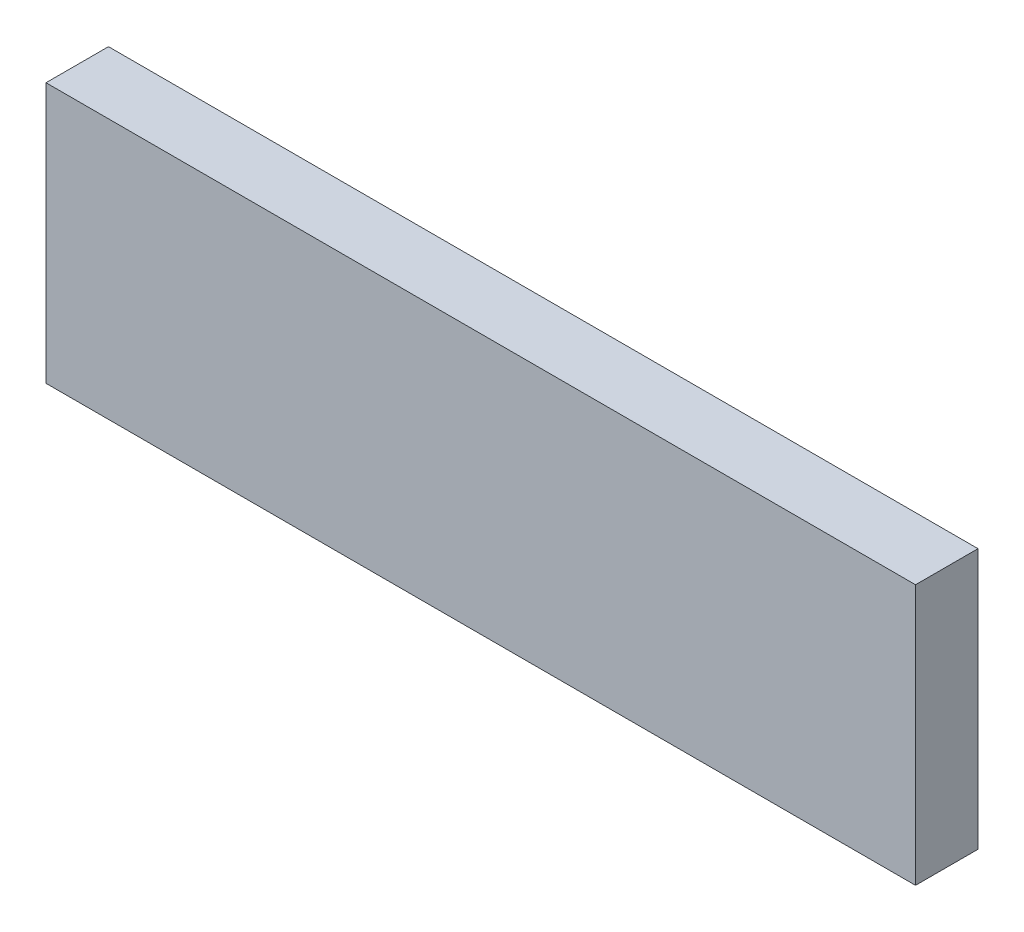
ISO-10303-21;
HEADER;
FILE_DESCRIPTION(('STEP AP214'),'2;1');
FILE_NAME('part.step','',(''),(''),'','','');
FILE_SCHEMA(('AUTOMOTIVE_DESIGN { 1 0 10303 214 1 1 1 1 }'));
ENDSEC;
DATA;
#1=APPLICATION_CONTEXT('core data for automotive mechanical design processes');
#2=APPLICATION_PROTOCOL_DEFINITION('international standard','automotive_design',2000,#1);
#3=PRODUCT_CONTEXT('',#1,'mechanical');
#4=PRODUCT('Part','Part','',(#3));
#5=PRODUCT_RELATED_PRODUCT_CATEGORY('part','',(#4));
#6=PRODUCT_DEFINITION_FORMATION('','',#4);
#7=PRODUCT_DEFINITION_CONTEXT('part definition',#1,'design');
#8=PRODUCT_DEFINITION('design','',#6,#7);
#9=PRODUCT_DEFINITION_SHAPE('','',#8);
#10=(LENGTH_UNIT() NAMED_UNIT(*) SI_UNIT(.MILLI.,.METRE.));
#11=(NAMED_UNIT(*) PLANE_ANGLE_UNIT() SI_UNIT($,.RADIAN.));
#12=(NAMED_UNIT(*) SI_UNIT($,.STERADIAN.) SOLID_ANGLE_UNIT());
#13=UNCERTAINTY_MEASURE_WITH_UNIT(LENGTH_MEASURE(1.E-05),#10,'distance_accuracy_value','');
#14=(GEOMETRIC_REPRESENTATION_CONTEXT(3) GLOBAL_UNCERTAINTY_ASSIGNED_CONTEXT((#13)) GLOBAL_UNIT_ASSIGNED_CONTEXT((#10,
#11,#12)) REPRESENTATION_CONTEXT('',''));
#15=CARTESIAN_POINT('',(0.,0.,0.));
#16=DIRECTION('',(0.,0.,1.));
#17=DIRECTION('',(1.,0.,0.));
#18=AXIS2_PLACEMENT_3D('',#15,#16,#17);
#19=CARTESIAN_POINT('',(83.5,25.,6.));
#20=DIRECTION('',(-1.,0.,0.));
#21=DIRECTION('',(0.,0.,1.));
#22=AXIS2_PLACEMENT_3D('',#19,#20,#21);
#23=PLANE('',#22);
#24=DIRECTION('',(0.,1.,0.));
#25=VECTOR('',#24,1.);
#26=CARTESIAN_POINT('',(83.5,25.,-6.));
#27=LINE('',#26,#25);
#28=CARTESIAN_POINT('',(83.5,-25.,-6.));
#29=VERTEX_POINT('',#28);
#30=CARTESIAN_POINT('',(83.5,25.,-6.));
#31=VERTEX_POINT('',#30);
#32=EDGE_CURVE('E98',#29,#31,#27,.T.);
#33=ORIENTED_EDGE('',*,*,#32,.T.);
#34=DIRECTION('',(0.,0.,-1.));
#35=VECTOR('',#34,1.);
#36=CARTESIAN_POINT('',(83.5,25.,6.));
#37=LINE('',#36,#35);
#38=CARTESIAN_POINT('',(83.5,25.,6.));
#39=VERTEX_POINT('',#38);
#40=EDGE_CURVE('E11',#39,#31,#37,.T.);
#41=ORIENTED_EDGE('',*,*,#40,.F.);
#42=DIRECTION('',(0.,1.,0.));
#43=VECTOR('',#42,1.);
#44=CARTESIAN_POINT('',(83.5,25.,6.));
#45=LINE('',#44,#43);
#46=CARTESIAN_POINT('',(83.5,-25.,6.));
#47=VERTEX_POINT('',#46);
#48=EDGE_CURVE('E86',#47,#39,#45,.T.);
#49=ORIENTED_EDGE('',*,*,#48,.F.);
#50=DIRECTION('',(0.,0.,-1.));
#51=VECTOR('',#50,1.);
#52=CARTESIAN_POINT('',(83.5,-25.,6.));
#53=LINE('',#52,#51);
#54=EDGE_CURVE('E94',#47,#29,#53,.T.);
#55=ORIENTED_EDGE('',*,*,#54,.T.);
#56=EDGE_LOOP('',(#33,#41,#49,#55));
#57=FACE_BOUND('',#56,.T.);
#58=ADVANCED_FACE('F35',(#57),#23,.F.);
#59=CARTESIAN_POINT('',(-83.5,25.,6.));
#60=DIRECTION('',(0.,-1.,0.));
#61=DIRECTION('',(0.,0.,-1.));
#62=AXIS2_PLACEMENT_3D('',#59,#60,#61);
#63=PLANE('',#62);
#64=DIRECTION('',(-1.,0.,0.));
#65=VECTOR('',#64,1.);
#66=CARTESIAN_POINT('',(-83.5,25.,-6.));
#67=LINE('',#66,#65);
#68=CARTESIAN_POINT('',(-83.5,25.,-6.));
#69=VERTEX_POINT('',#68);
#70=EDGE_CURVE('E90',#31,#69,#67,.T.);
#71=ORIENTED_EDGE('',*,*,#70,.T.);
#72=DIRECTION('',(0.,0.,-1.));
#73=VECTOR('',#72,1.);
#74=CARTESIAN_POINT('',(-83.5,25.,6.));
#75=LINE('',#74,#73);
#76=CARTESIAN_POINT('',(-83.5,25.,6.));
#77=VERTEX_POINT('',#76);
#78=EDGE_CURVE('E43',#77,#69,#75,.T.);
#79=ORIENTED_EDGE('',*,*,#78,.F.);
#80=DIRECTION('',(-1.,0.,0.));
#81=VECTOR('',#80,1.);
#82=CARTESIAN_POINT('',(-83.5,25.,6.));
#83=LINE('',#82,#81);
#84=EDGE_CURVE('E81',#39,#77,#83,.T.);
#85=ORIENTED_EDGE('',*,*,#84,.F.);
#86=ORIENTED_EDGE('',*,*,#40,.T.);
#87=EDGE_LOOP('',(#71,#79,#85,#86));
#88=FACE_BOUND('',#87,.T.);
#89=ADVANCED_FACE('F89',(#88),#63,.F.);
#90=CARTESIAN_POINT('',(-83.5,25.,6.));
#91=DIRECTION('',(1.,0.,0.));
#92=DIRECTION('',(0.,0.,-1.));
#93=AXIS2_PLACEMENT_3D('',#90,#91,#92);
#94=PLANE('',#93);
#95=DIRECTION('',(0.,-1.,0.));
#96=VECTOR('',#95,1.);
#97=CARTESIAN_POINT('',(-83.5,25.,-6.));
#98=LINE('',#97,#96);
#99=CARTESIAN_POINT('',(-83.5,-25.,-6.));
#100=VERTEX_POINT('',#99);
#101=EDGE_CURVE('E68',#69,#100,#98,.T.);
#102=ORIENTED_EDGE('',*,*,#101,.T.);
#103=DIRECTION('',(0.,0.,-1.));
#104=VECTOR('',#103,1.);
#105=CARTESIAN_POINT('',(-83.5,-25.,6.));
#106=LINE('',#105,#104);
#107=CARTESIAN_POINT('',(-83.5,-25.,6.));
#108=VERTEX_POINT('',#107);
#109=EDGE_CURVE('E91',#108,#100,#106,.T.);
#110=ORIENTED_EDGE('',*,*,#109,.F.);
#111=DIRECTION('',(0.,-1.,0.));
#112=VECTOR('',#111,1.);
#113=CARTESIAN_POINT('',(-83.5,25.,6.));
#114=LINE('',#113,#112);
#115=EDGE_CURVE('E84',#77,#108,#114,.T.);
#116=ORIENTED_EDGE('',*,*,#115,.F.);
#117=ORIENTED_EDGE('',*,*,#78,.T.);
#118=EDGE_LOOP('',(#102,#110,#116,#117));
#119=FACE_BOUND('',#118,.T.);
#120=ADVANCED_FACE('F92',(#119),#94,.F.);
#121=CARTESIAN_POINT('',(-83.5,-25.,6.));
#122=DIRECTION('',(0.,1.,0.));
#123=DIRECTION('',(0.,0.,1.));
#124=AXIS2_PLACEMENT_3D('',#121,#122,#123);
#125=PLANE('',#124);
#126=CARTESIAN_POINT('',(75.,-25.,0.));
#127=DIRECTION('',(0.,-1.,0.));
#128=DIRECTION('',(0.,0.,-1.));
#129=AXIS2_PLACEMENT_3D('',#126,#127,#128);
#130=CIRCLE('',#129,2.99999999999999);
#131=CARTESIAN_POINT('',(75.,-25.,-2.99999999999999));
#132=VERTEX_POINT('',#131);
#133=EDGE_CURVE('E118',#132,#132,#130,.T.);
#134=ORIENTED_EDGE('',*,*,#133,.F.);
#135=EDGE_LOOP('',(#134));
#136=FACE_BOUND('',#135,.T.);
#137=CARTESIAN_POINT('',(-75.,-25.,0.));
#138=DIRECTION('',(0.,-1.,0.));
#139=DIRECTION('',(0.,0.,-1.));
#140=AXIS2_PLACEMENT_3D('',#137,#138,#139);
#141=CIRCLE('',#140,3.00000000000001);
#142=CARTESIAN_POINT('',(-75.,-25.,-3.00000000000001));
#143=VERTEX_POINT('',#142);
#144=EDGE_CURVE('E112',#143,#143,#141,.T.);
#145=ORIENTED_EDGE('',*,*,#144,.F.);
#146=EDGE_LOOP('',(#145));
#147=FACE_BOUND('',#146,.T.);
#148=DIRECTION('',(1.,0.,0.));
#149=VECTOR('',#148,1.);
#150=CARTESIAN_POINT('',(-83.5,-25.,-6.));
#151=LINE('',#150,#149);
#152=EDGE_CURVE('E74',#100,#29,#151,.T.);
#153=ORIENTED_EDGE('',*,*,#152,.T.);
#154=ORIENTED_EDGE('',*,*,#54,.F.);
#155=DIRECTION('',(1.,0.,0.));
#156=VECTOR('',#155,1.);
#157=CARTESIAN_POINT('',(-83.5,-25.,6.));
#158=LINE('',#157,#156);
#159=EDGE_CURVE('E51',#108,#47,#158,.T.);
#160=ORIENTED_EDGE('',*,*,#159,.F.);
#161=ORIENTED_EDGE('',*,*,#109,.T.);
#162=EDGE_LOOP('',(#153,#154,#160,#161));
#163=FACE_BOUND('',#162,.T.);
#164=ADVANCED_FACE('F106',(#136,#147,#163),#125,.F.);
#165=CARTESIAN_POINT('',(0.,0.,6.));
#166=DIRECTION('',(0.,0.,1.));
#167=DIRECTION('',(1.,0.,0.));
#168=AXIS2_PLACEMENT_3D('',#165,#166,#167);
#169=PLANE('',#168);
#170=ORIENTED_EDGE('',*,*,#48,.T.);
#171=ORIENTED_EDGE('',*,*,#84,.T.);
#172=ORIENTED_EDGE('',*,*,#115,.T.);
#173=ORIENTED_EDGE('',*,*,#159,.T.);
#174=EDGE_LOOP('',(#170,#171,#172,#173));
#175=FACE_BOUND('',#174,.T.);
#176=ADVANCED_FACE('F82',(#175),#169,.T.);
#177=CARTESIAN_POINT('',(0.,0.,-6.));
#178=DIRECTION('',(0.,0.,1.));
#179=DIRECTION('',(1.,0.,0.));
#180=AXIS2_PLACEMENT_3D('',#177,#178,#179);
#181=PLANE('',#180);
#182=ORIENTED_EDGE('',*,*,#32,.F.);
#183=ORIENTED_EDGE('',*,*,#152,.F.);
#184=ORIENTED_EDGE('',*,*,#101,.F.);
#185=ORIENTED_EDGE('',*,*,#70,.F.);
#186=EDGE_LOOP('',(#182,#183,#184,#185));
#187=FACE_BOUND('',#186,.T.);
#188=ADVANCED_FACE('F109',(#187),#181,.F.);
#189=CARTESIAN_POINT('',(-75.,-4.99999999999999,0.));
#190=DIRECTION('',(0.,-1.,0.));
#191=DIRECTION('',(0.,0.,-1.));
#192=AXIS2_PLACEMENT_3D('',#189,#190,#191);
#193=CYLINDRICAL_SURFACE('',#192,3.00000000000001);
#194=CARTESIAN_POINT('',(-75.,-4.99999999999999,0.));
#195=DIRECTION('',(0.,-1.,0.));
#196=DIRECTION('',(0.,0.,-1.));
#197=AXIS2_PLACEMENT_3D('',#194,#195,#196);
#198=CIRCLE('',#197,3.00000000000001);
#199=CARTESIAN_POINT('',(-75.,-4.99999999999999,-3.00000000000001));
#200=VERTEX_POINT('',#199);
#201=EDGE_CURVE('E101',#200,#200,#198,.T.);
#202=ORIENTED_EDGE('',*,*,#201,.F.);
#203=EDGE_LOOP('',(#202));
#204=FACE_BOUND('',#203,.T.);
#205=ORIENTED_EDGE('',*,*,#144,.T.);
#206=EDGE_LOOP('',(#205));
#207=FACE_BOUND('',#206,.T.);
#208=ADVANCED_FACE('F138',(#204,#207),#193,.F.);
#209=CARTESIAN_POINT('',(-75.,-4.99999999999999,0.));
#210=DIRECTION('',(0.,-1.,0.));
#211=DIRECTION('',(0.,0.,-1.));
#212=AXIS2_PLACEMENT_3D('',#209,#210,#211);
#213=PLANE('',#212);
#214=ORIENTED_EDGE('',*,*,#201,.T.);
#215=EDGE_LOOP('',(#214));
#216=FACE_BOUND('',#215,.T.);
#217=ADVANCED_FACE('F129',(#216),#213,.T.);
#218=CARTESIAN_POINT('',(75.,-4.99999999999999,0.));
#219=DIRECTION('',(0.,-1.,0.));
#220=DIRECTION('',(0.,0.,-1.));
#221=AXIS2_PLACEMENT_3D('',#218,#219,#220);
#222=CYLINDRICAL_SURFACE('',#221,2.99999999999999);
#223=CARTESIAN_POINT('',(75.,-4.99999999999999,0.));
#224=DIRECTION('',(0.,-1.,0.));
#225=DIRECTION('',(0.,0.,-1.));
#226=AXIS2_PLACEMENT_3D('',#223,#224,#225);
#227=CIRCLE('',#226,2.99999999999999);
#228=CARTESIAN_POINT('',(75.,-4.99999999999999,-2.99999999999999));
#229=VERTEX_POINT('',#228);
#230=EDGE_CURVE('E115',#229,#229,#227,.T.);
#231=ORIENTED_EDGE('',*,*,#230,.F.);
#232=EDGE_LOOP('',(#231));
#233=FACE_BOUND('',#232,.T.);
#234=ORIENTED_EDGE('',*,*,#133,.T.);
#235=EDGE_LOOP('',(#234));
#236=FACE_BOUND('',#235,.T.);
#237=ADVANCED_FACE('F126',(#233,#236),#222,.F.);
#238=CARTESIAN_POINT('',(75.,-4.99999999999999,0.));
#239=DIRECTION('',(0.,-1.,0.));
#240=DIRECTION('',(0.,0.,-1.));
#241=AXIS2_PLACEMENT_3D('',#238,#239,#240);
#242=PLANE('',#241);
#243=ORIENTED_EDGE('',*,*,#230,.T.);
#244=EDGE_LOOP('',(#243));
#245=FACE_BOUND('',#244,.T.);
#246=ADVANCED_FACE('F124',(#245),#242,.T.);
#247=CLOSED_SHELL('',(#58,#89,#120,#164,#176,#188,#208,#217,#237,#246));
#248=MANIFOLD_SOLID_BREP('B2',#247);
#249=ADVANCED_BREP_SHAPE_REPRESENTATION('',(#18,#248),#14);
#250=SHAPE_DEFINITION_REPRESENTATION(#9,#249);
ENDSEC;
END-ISO-10303-21;
